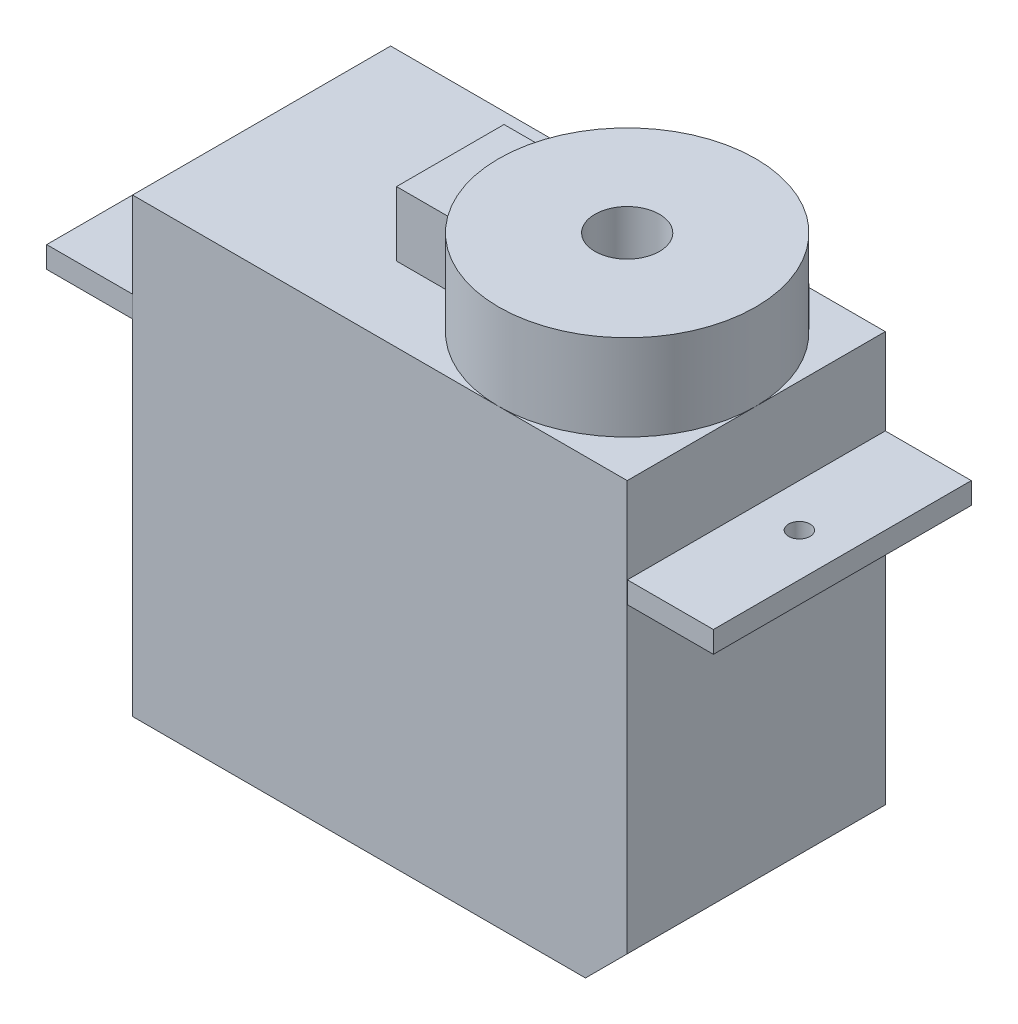
ISO-10303-21;
HEADER;
FILE_DESCRIPTION(('STEP AP214'),'2;1');
FILE_NAME('part.step','',(''),(''),'','','');
FILE_SCHEMA(('AUTOMOTIVE_DESIGN { 1 0 10303 214 1 1 1 1 }'));
ENDSEC;
DATA;
#1=APPLICATION_CONTEXT('core data for automotive mechanical design processes');
#2=APPLICATION_PROTOCOL_DEFINITION('international standard','automotive_design',2000,#1);
#3=PRODUCT_CONTEXT('',#1,'mechanical');
#4=PRODUCT('Part','Part','',(#3));
#5=PRODUCT_RELATED_PRODUCT_CATEGORY('part','',(#4));
#6=PRODUCT_DEFINITION_FORMATION('','',#4);
#7=PRODUCT_DEFINITION_CONTEXT('part definition',#1,'design');
#8=PRODUCT_DEFINITION('design','',#6,#7);
#9=PRODUCT_DEFINITION_SHAPE('','',#8);
#10=(LENGTH_UNIT() NAMED_UNIT(*) SI_UNIT(.MILLI.,.METRE.));
#11=(NAMED_UNIT(*) PLANE_ANGLE_UNIT() SI_UNIT($,.RADIAN.));
#12=(NAMED_UNIT(*) SI_UNIT($,.STERADIAN.) SOLID_ANGLE_UNIT());
#13=UNCERTAINTY_MEASURE_WITH_UNIT(LENGTH_MEASURE(1.E-05),#10,'distance_accuracy_value','');
#14=(GEOMETRIC_REPRESENTATION_CONTEXT(3) GLOBAL_UNCERTAINTY_ASSIGNED_CONTEXT((#13)) GLOBAL_UNIT_ASSIGNED_CONTEXT((#10,
#11,#12)) REPRESENTATION_CONTEXT('',''));
#15=CARTESIAN_POINT('',(0.,0.,0.));
#16=DIRECTION('',(0.,0.,1.));
#17=DIRECTION('',(1.,0.,0.));
#18=AXIS2_PLACEMENT_3D('',#15,#16,#17);
#19=CARTESIAN_POINT('',(0.,21.,0.));
#20=DIRECTION('',(0.,1.,0.));
#21=DIRECTION('',(0.,0.,1.));
#22=AXIS2_PLACEMENT_3D('',#19,#20,#21);
#23=PLANE('',#22);
#24=CARTESIAN_POINT('',(5.52357019337868,21.,0.0235701933786747));
#25=DIRECTION('',(0.,1.,0.));
#26=DIRECTION('',(0.,0.,1.));
#27=AXIS2_PLACEMENT_3D('',#24,#25,#26);
#28=CIRCLE('',#27,5.97642980662132);
#29=CARTESIAN_POINT('',(0.0951529992537095,21.,2.52357019337872));
#30=VERTEX_POINT('',#29);
#31=CARTESIAN_POINT('',(5.52357019337868,21.,6.));
#32=VERTEX_POINT('',#31);
#33=EDGE_CURVE('E196',#30,#32,#28,.T.);
#34=ORIENTED_EDGE('',*,*,#33,.F.);
#35=DIRECTION('',(1.,0.,0.));
#36=VECTOR('',#35,1.);
#37=CARTESIAN_POINT('',(1.79714038675735,21.,2.52357019337872));
#38=LINE('',#37,#36);
#39=CARTESIAN_POINT('',(-2.70285961324265,21.,2.52357019337872));
#40=VERTEX_POINT('',#39);
#41=EDGE_CURVE('E64',#40,#30,#38,.T.);
#42=ORIENTED_EDGE('',*,*,#41,.F.);
#43=DIRECTION('',(0.,0.,1.));
#44=VECTOR('',#43,1.);
#45=CARTESIAN_POINT('',(-2.70285961324265,21.,-2.47642980662128));
#46=LINE('',#45,#44);
#47=CARTESIAN_POINT('',(-2.70285961324265,21.,-2.47642980662128));
#48=VERTEX_POINT('',#47);
#49=EDGE_CURVE('E237',#48,#40,#46,.T.);
#50=ORIENTED_EDGE('',*,*,#49,.F.);
#51=DIRECTION('',(-1.,0.,0.));
#52=VECTOR('',#51,1.);
#53=CARTESIAN_POINT('',(1.79714038675735,21.,-2.47642980662128));
#54=LINE('',#53,#52);
#55=CARTESIAN_POINT('',(0.0951529992536714,21.,-2.47642980662128));
#56=VERTEX_POINT('',#55);
#57=EDGE_CURVE('E213',#56,#48,#54,.T.);
#58=ORIENTED_EDGE('',*,*,#57,.F.);
#59=CARTESIAN_POINT('',(11.5,21.,0.0235701933786747));
#60=VERTEX_POINT('',#59);
#61=EDGE_CURVE('E205',#60,#56,#28,.T.);
#62=ORIENTED_EDGE('',*,*,#61,.F.);
#63=DIRECTION('',(0.,0.,-1.));
#64=VECTOR('',#63,1.);
#65=CARTESIAN_POINT('',(11.5,21.,-6.));
#66=LINE('',#65,#64);
#67=CARTESIAN_POINT('',(11.5,21.,-6.));
#68=VERTEX_POINT('',#67);
#69=EDGE_CURVE('E356',#60,#68,#66,.T.);
#70=ORIENTED_EDGE('',*,*,#69,.T.);
#71=DIRECTION('',(-1.,0.,0.));
#72=VECTOR('',#71,1.);
#73=CARTESIAN_POINT('',(-11.5,21.,-6.));
#74=LINE('',#73,#72);
#75=CARTESIAN_POINT('',(-11.5,21.,-6.));
#76=VERTEX_POINT('',#75);
#77=EDGE_CURVE('E355',#68,#76,#74,.T.);
#78=ORIENTED_EDGE('',*,*,#77,.T.);
#79=DIRECTION('',(0.,0.,1.));
#80=VECTOR('',#79,1.);
#81=CARTESIAN_POINT('',(-11.5,21.,-6.));
#82=LINE('',#81,#80);
#83=CARTESIAN_POINT('',(-11.5,21.,6.));
#84=VERTEX_POINT('',#83);
#85=EDGE_CURVE('E359',#76,#84,#82,.T.);
#86=ORIENTED_EDGE('',*,*,#85,.T.);
#87=DIRECTION('',(1.,0.,0.));
#88=VECTOR('',#87,1.);
#89=CARTESIAN_POINT('',(-11.5,21.,6.));
#90=LINE('',#89,#88);
#91=EDGE_CURVE('E363',#84,#32,#90,.T.);
#92=ORIENTED_EDGE('',*,*,#91,.T.);
#93=EDGE_LOOP('',(#34,#42,#50,#58,#62,#70,#78,#86,#92));
#94=FACE_BOUND('',#93,.T.);
#95=ADVANCED_FACE('F40',(#94),#23,.T.);
#96=CARTESIAN_POINT('',(5.52357019337868,25.,0.0235701933786747));
#97=DIRECTION('',(0.,-1.,0.));
#98=DIRECTION('',(0.,0.,-1.));
#99=AXIS2_PLACEMENT_3D('',#96,#97,#98);
#100=CYLINDRICAL_SURFACE('',#99,5.97642980662132);
#101=CARTESIAN_POINT('',(5.52357019337868,25.,0.0235701933786747));
#102=DIRECTION('',(0.,1.,0.));
#103=DIRECTION('',(0.,0.,1.));
#104=AXIS2_PLACEMENT_3D('',#101,#102,#103);
#105=CIRCLE('',#104,5.97642980662132);
#106=CARTESIAN_POINT('',(5.52357019337868,25.,6.));
#107=VERTEX_POINT('',#106);
#108=EDGE_CURVE('E251',#107,#107,#105,.T.);
#109=ORIENTED_EDGE('',*,*,#108,.F.);
#110=EDGE_LOOP('',(#109));
#111=FACE_BOUND('',#110,.T.);
#112=DIRECTION('',(0.,-1.,0.));
#113=VECTOR('',#112,1.);
#114=CARTESIAN_POINT('',(0.0951529992537095,25.,2.52357019337872));
#115=LINE('',#114,#113);
#116=CARTESIAN_POINT('',(0.0951529992537095,24.,2.52357019337872));
#117=VERTEX_POINT('',#116);
#118=EDGE_CURVE('E11',#30,#117,#115,.F.);
#119=ORIENTED_EDGE('',*,*,#118,.F.);
#120=ORIENTED_EDGE('',*,*,#33,.T.);
#121=EDGE_CURVE('E250',#32,#60,#28,.T.);
#122=ORIENTED_EDGE('',*,*,#121,.T.);
#123=ORIENTED_EDGE('',*,*,#61,.T.);
#124=DIRECTION('',(0.,-1.,0.));
#125=VECTOR('',#124,1.);
#126=CARTESIAN_POINT('',(0.0951529992536714,25.,-2.47642980662128));
#127=LINE('',#126,#125);
#128=CARTESIAN_POINT('',(0.0951529992536714,24.,-2.47642980662128));
#129=VERTEX_POINT('',#128);
#130=EDGE_CURVE('E49',#129,#56,#127,.T.);
#131=ORIENTED_EDGE('',*,*,#130,.F.);
#132=CARTESIAN_POINT('',(5.52357019337868,24.,0.0235701933786747));
#133=DIRECTION('',(0.,-1.,0.));
#134=DIRECTION('',(0.,0.,-1.));
#135=AXIS2_PLACEMENT_3D('',#132,#133,#134);
#136=CIRCLE('',#135,5.97642980662132);
#137=EDGE_CURVE('E202',#117,#129,#136,.T.);
#138=ORIENTED_EDGE('',*,*,#137,.F.);
#139=EDGE_LOOP('',(#119,#120,#122,#123,#131,#138));
#140=FACE_BOUND('',#139,.T.);
#141=ADVANCED_FACE('F218',(#111,#140),#100,.T.);
#142=ORIENTED_EDGE('',*,*,#121,.F.);
#143=CARTESIAN_POINT('',(11.5,21.,6.));
#144=VERTEX_POINT('',#143);
#145=EDGE_CURVE('E362',#32,#144,#90,.T.);
#146=ORIENTED_EDGE('',*,*,#145,.T.);
#147=EDGE_CURVE('E351',#144,#60,#66,.T.);
#148=ORIENTED_EDGE('',*,*,#147,.T.);
#149=EDGE_LOOP('',(#142,#146,#148));
#150=FACE_BOUND('',#149,.T.);
#151=ADVANCED_FACE('F421',(#150),#23,.T.);
#152=CARTESIAN_POINT('',(-11.5,21.,-6.));
#153=DIRECTION('',(1.,0.,0.));
#154=DIRECTION('',(0.,0.,-1.));
#155=AXIS2_PLACEMENT_3D('',#152,#153,#154);
#156=PLANE('',#155);
#157=DIRECTION('',(0.,0.,1.));
#158=VECTOR('',#157,1.);
#159=CARTESIAN_POINT('',(-11.5,16.,-6.));
#160=LINE('',#159,#158);
#161=CARTESIAN_POINT('',(-11.5,16.,-6.));
#162=VERTEX_POINT('',#161);
#163=CARTESIAN_POINT('',(-11.5,16.,5.99258531427078));
#164=VERTEX_POINT('',#163);
#165=EDGE_CURVE('E262',#162,#164,#160,.T.);
#166=ORIENTED_EDGE('',*,*,#165,.F.);
#167=DIRECTION('',(0.,-1.,0.));
#168=VECTOR('',#167,1.);
#169=CARTESIAN_POINT('',(-11.5,21.,-6.));
#170=LINE('',#169,#168);
#171=CARTESIAN_POINT('',(-11.5,0.,-6.));
#172=VERTEX_POINT('',#171);
#173=EDGE_CURVE('E198',#162,#172,#170,.T.);
#174=ORIENTED_EDGE('',*,*,#173,.T.);
#175=DIRECTION('',(0.,0.,1.));
#176=VECTOR('',#175,1.);
#177=CARTESIAN_POINT('',(-11.5,0.,-6.));
#178=LINE('',#177,#176);
#179=CARTESIAN_POINT('',(-11.5,0.,6.));
#180=VERTEX_POINT('',#179);
#181=EDGE_CURVE('E369',#172,#180,#178,.T.);
#182=ORIENTED_EDGE('',*,*,#181,.T.);
#183=DIRECTION('',(0.,-1.,0.));
#184=VECTOR('',#183,1.);
#185=CARTESIAN_POINT('',(-11.5,21.,6.));
#186=LINE('',#185,#184);
#187=EDGE_CURVE('E377',#84,#180,#186,.T.);
#188=ORIENTED_EDGE('',*,*,#187,.F.);
#189=ORIENTED_EDGE('',*,*,#85,.F.);
#190=CARTESIAN_POINT('',(-11.5,17.,-6.));
#191=VERTEX_POINT('',#190);
#192=EDGE_CURVE('E191',#76,#191,#170,.T.);
#193=ORIENTED_EDGE('',*,*,#192,.T.);
#194=DIRECTION('',(0.,0.,1.));
#195=VECTOR('',#194,1.);
#196=CARTESIAN_POINT('',(-11.5,17.,-6.));
#197=LINE('',#196,#195);
#198=CARTESIAN_POINT('',(-11.5,17.,5.99258531427078));
#199=VERTEX_POINT('',#198);
#200=EDGE_CURVE('E266',#191,#199,#197,.T.);
#201=ORIENTED_EDGE('',*,*,#200,.T.);
#202=DIRECTION('',(0.,-1.,0.));
#203=VECTOR('',#202,1.);
#204=CARTESIAN_POINT('',(-11.5,17.,5.99258531427078));
#205=LINE('',#204,#203);
#206=EDGE_CURVE('E283',#199,#164,#205,.T.);
#207=ORIENTED_EDGE('',*,*,#206,.T.);
#208=EDGE_LOOP('',(#166,#174,#182,#188,#189,#193,#201,#207));
#209=FACE_BOUND('',#208,.T.);
#210=ADVANCED_FACE('F390',(#209),#156,.F.);
#211=CARTESIAN_POINT('',(11.5,21.,-6.));
#212=DIRECTION('',(-1.,0.,0.));
#213=DIRECTION('',(0.,0.,1.));
#214=AXIS2_PLACEMENT_3D('',#211,#212,#213);
#215=PLANE('',#214);
#216=DIRECTION('',(0.,-1.,0.));
#217=VECTOR('',#216,1.);
#218=CARTESIAN_POINT('',(11.5,21.,6.));
#219=LINE('',#218,#217);
#220=CARTESIAN_POINT('',(11.5,1.94058057976703,6.));
#221=VERTEX_POINT('',#220);
#222=EDGE_CURVE('E181',#144,#221,#219,.T.);
#223=ORIENTED_EDGE('',*,*,#222,.T.);
#224=DIRECTION('',(0.,0.,1.));
#225=VECTOR('',#224,1.);
#226=CARTESIAN_POINT('',(11.5,1.94058057976703,-6.));
#227=LINE('',#226,#225);
#228=CARTESIAN_POINT('',(11.5,1.94058057976703,-6.));
#229=VERTEX_POINT('',#228);
#230=EDGE_CURVE('E168',#229,#221,#227,.T.);
#231=ORIENTED_EDGE('',*,*,#230,.F.);
#232=DIRECTION('',(0.,-1.,0.));
#233=VECTOR('',#232,1.);
#234=CARTESIAN_POINT('',(11.5,21.,-6.));
#235=LINE('',#234,#233);
#236=CARTESIAN_POINT('',(11.5,16.,-6.));
#237=VERTEX_POINT('',#236);
#238=EDGE_CURVE('E177',#237,#229,#235,.T.);
#239=ORIENTED_EDGE('',*,*,#238,.F.);
#240=DIRECTION('',(0.,0.,1.));
#241=VECTOR('',#240,1.);
#242=CARTESIAN_POINT('',(11.5,16.,-6.));
#243=LINE('',#242,#241);
#244=CARTESIAN_POINT('',(11.5,16.,5.99258531427078));
#245=VERTEX_POINT('',#244);
#246=EDGE_CURVE('E311',#237,#245,#243,.T.);
#247=ORIENTED_EDGE('',*,*,#246,.T.);
#248=DIRECTION('',(0.,-1.,0.));
#249=VECTOR('',#248,1.);
#250=CARTESIAN_POINT('',(11.5,17.,5.99258531427078));
#251=LINE('',#250,#249);
#252=CARTESIAN_POINT('',(11.5,17.,5.99258531427078));
#253=VERTEX_POINT('',#252);
#254=EDGE_CURVE('E346',#253,#245,#251,.T.);
#255=ORIENTED_EDGE('',*,*,#254,.F.);
#256=DIRECTION('',(0.,0.,1.));
#257=VECTOR('',#256,1.);
#258=CARTESIAN_POINT('',(11.5,17.,-6.));
#259=LINE('',#258,#257);
#260=CARTESIAN_POINT('',(11.5,17.,-6.));
#261=VERTEX_POINT('',#260);
#262=EDGE_CURVE('E315',#261,#253,#259,.T.);
#263=ORIENTED_EDGE('',*,*,#262,.F.);
#264=EDGE_CURVE('E190',#68,#261,#235,.T.);
#265=ORIENTED_EDGE('',*,*,#264,.F.);
#266=ORIENTED_EDGE('',*,*,#69,.F.);
#267=ORIENTED_EDGE('',*,*,#147,.F.);
#268=EDGE_LOOP('',(#223,#231,#239,#247,#255,#263,#265,#266,#267));
#269=FACE_BOUND('',#268,.T.);
#270=ADVANCED_FACE('F42',(#269),#215,.F.);
#271=CARTESIAN_POINT('',(-11.5,21.,-6.));
#272=DIRECTION('',(0.,0.,1.));
#273=DIRECTION('',(1.,0.,0.));
#274=AXIS2_PLACEMENT_3D('',#271,#272,#273);
#275=PLANE('',#274);
#276=ORIENTED_EDGE('',*,*,#238,.T.);
#277=DIRECTION('',(-0.707106781186545,-0.70710678118655,0.));
#278=VECTOR('',#277,1.);
#279=CARTESIAN_POINT('',(9.55941942023299,0.,-6.));
#280=LINE('',#279,#278);
#281=CARTESIAN_POINT('',(9.55941942023299,0.,-6.));
#282=VERTEX_POINT('',#281);
#283=EDGE_CURVE('E165',#229,#282,#280,.T.);
#284=ORIENTED_EDGE('',*,*,#283,.T.);
#285=DIRECTION('',(-1.,0.,0.));
#286=VECTOR('',#285,1.);
#287=CARTESIAN_POINT('',(-11.5,0.,-6.));
#288=LINE('',#287,#286);
#289=EDGE_CURVE('E350',#282,#172,#288,.T.);
#290=ORIENTED_EDGE('',*,*,#289,.T.);
#291=ORIENTED_EDGE('',*,*,#173,.F.);
#292=DIRECTION('',(1.,0.,0.));
#293=VECTOR('',#292,1.);
#294=CARTESIAN_POINT('',(-11.5,16.,-6.));
#295=LINE('',#294,#293);
#296=CARTESIAN_POINT('',(-15.5,16.,-6.));
#297=VERTEX_POINT('',#296);
#298=EDGE_CURVE('E287',#297,#162,#295,.T.);
#299=ORIENTED_EDGE('',*,*,#298,.F.);
#300=DIRECTION('',(0.,-1.,0.));
#301=VECTOR('',#300,1.);
#302=CARTESIAN_POINT('',(-15.5,17.,-6.));
#303=LINE('',#302,#301);
#304=CARTESIAN_POINT('',(-15.5,17.,-6.));
#305=VERTEX_POINT('',#304);
#306=EDGE_CURVE('E303',#305,#297,#303,.T.);
#307=ORIENTED_EDGE('',*,*,#306,.F.);
#308=DIRECTION('',(1.,0.,0.));
#309=VECTOR('',#308,1.);
#310=CARTESIAN_POINT('',(-11.5,17.,-6.));
#311=LINE('',#310,#309);
#312=EDGE_CURVE('E270',#305,#191,#311,.T.);
#313=ORIENTED_EDGE('',*,*,#312,.T.);
#314=ORIENTED_EDGE('',*,*,#192,.F.);
#315=ORIENTED_EDGE('',*,*,#77,.F.);
#316=ORIENTED_EDGE('',*,*,#264,.T.);
#317=DIRECTION('',(-1.,0.,0.));
#318=VECTOR('',#317,1.);
#319=CARTESIAN_POINT('',(11.5,17.,-6.));
#320=LINE('',#319,#318);
#321=CARTESIAN_POINT('',(15.5,17.,-6.));
#322=VERTEX_POINT('',#321);
#323=EDGE_CURVE('E325',#322,#261,#320,.T.);
#324=ORIENTED_EDGE('',*,*,#323,.F.);
#325=DIRECTION('',(0.,-1.,0.));
#326=VECTOR('',#325,1.);
#327=CARTESIAN_POINT('',(15.5,17.,-6.));
#328=LINE('',#327,#326);
#329=CARTESIAN_POINT('',(15.5,16.,-6.));
#330=VERTEX_POINT('',#329);
#331=EDGE_CURVE('E329',#322,#330,#328,.T.);
#332=ORIENTED_EDGE('',*,*,#331,.T.);
#333=DIRECTION('',(-1.,0.,0.));
#334=VECTOR('',#333,1.);
#335=CARTESIAN_POINT('',(11.5,16.,-6.));
#336=LINE('',#335,#334);
#337=EDGE_CURVE('E187',#330,#237,#336,.T.);
#338=ORIENTED_EDGE('',*,*,#337,.T.);
#339=EDGE_LOOP('',(#276,#284,#290,#291,#299,#307,#313,#314,#315,#316,#324,#332,#338));
#340=FACE_BOUND('',#339,.T.);
#341=ADVANCED_FACE('F184',(#340),#275,.F.);
#342=CARTESIAN_POINT('',(-11.5,21.,6.));
#343=DIRECTION('',(0.,0.,-1.));
#344=DIRECTION('',(-1.,0.,0.));
#345=AXIS2_PLACEMENT_3D('',#342,#343,#344);
#346=PLANE('',#345);
#347=DIRECTION('',(1.,0.,0.));
#348=VECTOR('',#347,1.);
#349=CARTESIAN_POINT('',(-11.5,0.,6.));
#350=LINE('',#349,#348);
#351=CARTESIAN_POINT('',(9.55941942023299,0.,6.));
#352=VERTEX_POINT('',#351);
#353=EDGE_CURVE('E372',#180,#352,#350,.T.);
#354=ORIENTED_EDGE('',*,*,#353,.T.);
#355=DIRECTION('',(-0.707106781186545,-0.70710678118655,0.));
#356=VECTOR('',#355,1.);
#357=CARTESIAN_POINT('',(9.55941942023299,0.,6.));
#358=LINE('',#357,#356);
#359=EDGE_CURVE('E56',#221,#352,#358,.T.);
#360=ORIENTED_EDGE('',*,*,#359,.F.);
#361=ORIENTED_EDGE('',*,*,#222,.F.);
#362=ORIENTED_EDGE('',*,*,#145,.F.);
#363=ORIENTED_EDGE('',*,*,#91,.F.);
#364=ORIENTED_EDGE('',*,*,#187,.T.);
#365=EDGE_LOOP('',(#354,#360,#361,#362,#363,#364));
#366=FACE_BOUND('',#365,.T.);
#367=ADVANCED_FACE('F394',(#366),#346,.F.);
#368=CARTESIAN_POINT('',(0.,0.,0.));
#369=DIRECTION('',(0.,1.,0.));
#370=DIRECTION('',(0.,0.,1.));
#371=AXIS2_PLACEMENT_3D('',#368,#369,#370);
#372=PLANE('',#371);
#373=ORIENTED_EDGE('',*,*,#289,.F.);
#374=DIRECTION('',(0.,0.,1.));
#375=VECTOR('',#374,1.);
#376=CARTESIAN_POINT('',(9.55941942023299,0.,-6.));
#377=LINE('',#376,#375);
#378=EDGE_CURVE('E169',#282,#352,#377,.T.);
#379=ORIENTED_EDGE('',*,*,#378,.T.);
#380=ORIENTED_EDGE('',*,*,#353,.F.);
#381=ORIENTED_EDGE('',*,*,#181,.F.);
#382=EDGE_LOOP('',(#373,#379,#380,#381));
#383=FACE_BOUND('',#382,.T.);
#384=ADVANCED_FACE('F393',(#383),#372,.F.);
#385=CARTESIAN_POINT('',(11.5,17.,5.99258531427078));
#386=DIRECTION('',(0.,0.,-1.));
#387=DIRECTION('',(-1.,0.,0.));
#388=AXIS2_PLACEMENT_3D('',#385,#386,#387);
#389=PLANE('',#388);
#390=DIRECTION('',(1.,0.,0.));
#391=VECTOR('',#390,1.);
#392=CARTESIAN_POINT('',(11.5,16.,5.99258531427078));
#393=LINE('',#392,#391);
#394=CARTESIAN_POINT('',(15.5,16.,5.99258531427078));
#395=VERTEX_POINT('',#394);
#396=EDGE_CURVE('E332',#245,#395,#393,.T.);
#397=ORIENTED_EDGE('',*,*,#396,.T.);
#398=DIRECTION('',(0.,-1.,0.));
#399=VECTOR('',#398,1.);
#400=CARTESIAN_POINT('',(15.5,17.,5.99258531427078));
#401=LINE('',#400,#399);
#402=CARTESIAN_POINT('',(15.5,17.,5.99258531427078));
#403=VERTEX_POINT('',#402);
#404=EDGE_CURVE('E342',#403,#395,#401,.T.);
#405=ORIENTED_EDGE('',*,*,#404,.F.);
#406=DIRECTION('',(1.,0.,0.));
#407=VECTOR('',#406,1.);
#408=CARTESIAN_POINT('',(11.5,17.,5.99258531427078));
#409=LINE('',#408,#407);
#410=EDGE_CURVE('E319',#253,#403,#409,.T.);
#411=ORIENTED_EDGE('',*,*,#410,.F.);
#412=ORIENTED_EDGE('',*,*,#254,.T.);
#413=EDGE_LOOP('',(#397,#405,#411,#412));
#414=FACE_BOUND('',#413,.T.);
#415=ADVANCED_FACE('F465',(#414),#389,.F.);
#416=CARTESIAN_POINT('',(15.5,17.,-6.));
#417=DIRECTION('',(-1.,0.,0.));
#418=DIRECTION('',(0.,0.,1.));
#419=AXIS2_PLACEMENT_3D('',#416,#417,#418);
#420=PLANE('',#419);
#421=DIRECTION('',(0.,0.,-1.));
#422=VECTOR('',#421,1.);
#423=CARTESIAN_POINT('',(15.5,16.,-6.));
#424=LINE('',#423,#422);
#425=EDGE_CURVE('E335',#395,#330,#424,.T.);
#426=ORIENTED_EDGE('',*,*,#425,.T.);
#427=ORIENTED_EDGE('',*,*,#331,.F.);
#428=DIRECTION('',(0.,0.,-1.));
#429=VECTOR('',#428,1.);
#430=CARTESIAN_POINT('',(15.5,17.,-6.));
#431=LINE('',#430,#429);
#432=EDGE_CURVE('E322',#403,#322,#431,.T.);
#433=ORIENTED_EDGE('',*,*,#432,.F.);
#434=ORIENTED_EDGE('',*,*,#404,.T.);
#435=EDGE_LOOP('',(#426,#427,#433,#434));
#436=FACE_BOUND('',#435,.T.);
#437=ADVANCED_FACE('F458',(#436),#420,.F.);
#438=CARTESIAN_POINT('',(0.,17.,0.));
#439=DIRECTION('',(0.,1.,0.));
#440=DIRECTION('',(0.,0.,1.));
#441=AXIS2_PLACEMENT_3D('',#438,#439,#440);
#442=PLANE('',#441);
#443=CARTESIAN_POINT('',(13.5,17.,-0.00370734286461033));
#444=DIRECTION('',(0.,1.,0.));
#445=DIRECTION('',(0.,0.,1.));
#446=AXIS2_PLACEMENT_3D('',#443,#444,#445);
#447=CIRCLE('',#446,0.500000000000001);
#448=CARTESIAN_POINT('',(13.5,17.,0.49629265713539));
#449=VERTEX_POINT('',#448);
#450=EDGE_CURVE('E306',#449,#449,#447,.T.);
#451=ORIENTED_EDGE('',*,*,#450,.F.);
#452=EDGE_LOOP('',(#451));
#453=FACE_BOUND('',#452,.T.);
#454=ORIENTED_EDGE('',*,*,#262,.T.);
#455=ORIENTED_EDGE('',*,*,#410,.T.);
#456=ORIENTED_EDGE('',*,*,#432,.T.);
#457=ORIENTED_EDGE('',*,*,#323,.T.);
#458=EDGE_LOOP('',(#454,#455,#456,#457));
#459=FACE_BOUND('',#458,.T.);
#460=ADVANCED_FACE('F455',(#453,#459),#442,.T.);
#461=CARTESIAN_POINT('',(0.,16.,0.));
#462=DIRECTION('',(0.,1.,0.));
#463=DIRECTION('',(0.,0.,1.));
#464=AXIS2_PLACEMENT_3D('',#461,#462,#463);
#465=PLANE('',#464);
#466=CARTESIAN_POINT('',(13.5,16.,-0.00370734286461033));
#467=DIRECTION('',(0.,1.,0.));
#468=DIRECTION('',(0.,0.,1.));
#469=AXIS2_PLACEMENT_3D('',#466,#467,#468);
#470=CIRCLE('',#469,0.500000000000001);
#471=CARTESIAN_POINT('',(13.5,16.,0.49629265713539));
#472=VERTEX_POINT('',#471);
#473=EDGE_CURVE('E307',#472,#472,#470,.T.);
#474=ORIENTED_EDGE('',*,*,#473,.T.);
#475=EDGE_LOOP('',(#474));
#476=FACE_BOUND('',#475,.T.);
#477=ORIENTED_EDGE('',*,*,#246,.F.);
#478=ORIENTED_EDGE('',*,*,#337,.F.);
#479=ORIENTED_EDGE('',*,*,#425,.F.);
#480=ORIENTED_EDGE('',*,*,#396,.F.);
#481=EDGE_LOOP('',(#477,#478,#479,#480));
#482=FACE_BOUND('',#481,.T.);
#483=ADVANCED_FACE('F453',(#476,#482),#465,.F.);
#484=CARTESIAN_POINT('',(13.5,16.,-0.00370734286461033));
#485=DIRECTION('',(0.,1.,0.));
#486=DIRECTION('',(0.,0.,1.));
#487=AXIS2_PLACEMENT_3D('',#484,#485,#486);
#488=CYLINDRICAL_SURFACE('',#487,0.500000000000001);
#489=ORIENTED_EDGE('',*,*,#473,.F.);
#490=EDGE_LOOP('',(#489));
#491=FACE_BOUND('',#490,.T.);
#492=ORIENTED_EDGE('',*,*,#450,.T.);
#493=EDGE_LOOP('',(#492));
#494=FACE_BOUND('',#493,.T.);
#495=ADVANCED_FACE('F449',(#491,#494),#488,.F.);
#496=CARTESIAN_POINT('',(-15.5,17.,-6.));
#497=DIRECTION('',(-1.,0.,0.));
#498=DIRECTION('',(0.,0.,1.));
#499=AXIS2_PLACEMENT_3D('',#496,#497,#498);
#500=PLANE('',#499);
#501=DIRECTION('',(0.,0.,-1.));
#502=VECTOR('',#501,1.);
#503=CARTESIAN_POINT('',(-15.5,16.,-6.));
#504=LINE('',#503,#502);
#505=CARTESIAN_POINT('',(-15.5,16.,5.99258531427078));
#506=VERTEX_POINT('',#505);
#507=EDGE_CURVE('E290',#506,#297,#504,.T.);
#508=ORIENTED_EDGE('',*,*,#507,.F.);
#509=DIRECTION('',(0.,-1.,0.));
#510=VECTOR('',#509,1.);
#511=CARTESIAN_POINT('',(-15.5,17.,5.99258531427078));
#512=LINE('',#511,#510);
#513=CARTESIAN_POINT('',(-15.5,17.,5.99258531427078));
#514=VERTEX_POINT('',#513);
#515=EDGE_CURVE('E300',#514,#506,#512,.T.);
#516=ORIENTED_EDGE('',*,*,#515,.F.);
#517=DIRECTION('',(0.,0.,-1.));
#518=VECTOR('',#517,1.);
#519=CARTESIAN_POINT('',(-15.5,17.,-6.));
#520=LINE('',#519,#518);
#521=EDGE_CURVE('E275',#514,#305,#520,.T.);
#522=ORIENTED_EDGE('',*,*,#521,.T.);
#523=ORIENTED_EDGE('',*,*,#306,.T.);
#524=EDGE_LOOP('',(#508,#516,#522,#523));
#525=FACE_BOUND('',#524,.T.);
#526=ADVANCED_FACE('F445',(#525),#500,.T.);
#527=CARTESIAN_POINT('',(-11.5,17.,5.99258531427078));
#528=DIRECTION('',(0.,0.,1.));
#529=DIRECTION('',(1.,0.,0.));
#530=AXIS2_PLACEMENT_3D('',#527,#528,#529);
#531=PLANE('',#530);
#532=DIRECTION('',(-1.,0.,0.));
#533=VECTOR('',#532,1.);
#534=CARTESIAN_POINT('',(-11.5,16.,5.99258531427078));
#535=LINE('',#534,#533);
#536=EDGE_CURVE('E271',#164,#506,#535,.T.);
#537=ORIENTED_EDGE('',*,*,#536,.F.);
#538=ORIENTED_EDGE('',*,*,#206,.F.);
#539=DIRECTION('',(-1.,0.,0.));
#540=VECTOR('',#539,1.);
#541=CARTESIAN_POINT('',(-11.5,17.,5.99258531427078));
#542=LINE('',#541,#540);
#543=EDGE_CURVE('E279',#199,#514,#542,.T.);
#544=ORIENTED_EDGE('',*,*,#543,.T.);
#545=ORIENTED_EDGE('',*,*,#515,.T.);
#546=EDGE_LOOP('',(#537,#538,#544,#545));
#547=FACE_BOUND('',#546,.T.);
#548=ADVANCED_FACE('F438',(#547),#531,.T.);
#549=CARTESIAN_POINT('',(0.,17.,0.));
#550=DIRECTION('',(0.,1.,0.));
#551=DIRECTION('',(0.,0.,1.));
#552=AXIS2_PLACEMENT_3D('',#549,#550,#551);
#553=PLANE('',#552);
#554=CARTESIAN_POINT('',(-13.5,17.,-0.00370734286461033));
#555=DIRECTION('',(0.,-1.,0.));
#556=DIRECTION('',(0.,0.,1.));
#557=AXIS2_PLACEMENT_3D('',#554,#555,#556);
#558=CIRCLE('',#557,0.500000000000001);
#559=CARTESIAN_POINT('',(-13.5,17.,0.49629265713539));
#560=VERTEX_POINT('',#559);
#561=EDGE_CURVE('E255',#560,#560,#558,.T.);
#562=ORIENTED_EDGE('',*,*,#561,.T.);
#563=EDGE_LOOP('',(#562));
#564=FACE_BOUND('',#563,.T.);
#565=ORIENTED_EDGE('',*,*,#200,.F.);
#566=ORIENTED_EDGE('',*,*,#312,.F.);
#567=ORIENTED_EDGE('',*,*,#521,.F.);
#568=ORIENTED_EDGE('',*,*,#543,.F.);
#569=EDGE_LOOP('',(#565,#566,#567,#568));
#570=FACE_BOUND('',#569,.T.);
#571=ADVANCED_FACE('F435',(#564,#570),#553,.T.);
#572=CARTESIAN_POINT('',(0.,16.,0.));
#573=DIRECTION('',(0.,1.,0.));
#574=DIRECTION('',(0.,0.,1.));
#575=AXIS2_PLACEMENT_3D('',#572,#573,#574);
#576=PLANE('',#575);
#577=CARTESIAN_POINT('',(-13.5,16.,-0.00370734286461033));
#578=DIRECTION('',(0.,-1.,0.));
#579=DIRECTION('',(0.,0.,1.));
#580=AXIS2_PLACEMENT_3D('',#577,#578,#579);
#581=CIRCLE('',#580,0.500000000000001);
#582=CARTESIAN_POINT('',(-13.5,16.,0.49629265713539));
#583=VERTEX_POINT('',#582);
#584=EDGE_CURVE('E258',#583,#583,#581,.T.);
#585=ORIENTED_EDGE('',*,*,#584,.F.);
#586=EDGE_LOOP('',(#585));
#587=FACE_BOUND('',#586,.T.);
#588=ORIENTED_EDGE('',*,*,#165,.T.);
#589=ORIENTED_EDGE('',*,*,#536,.T.);
#590=ORIENTED_EDGE('',*,*,#507,.T.);
#591=ORIENTED_EDGE('',*,*,#298,.T.);
#592=EDGE_LOOP('',(#588,#589,#590,#591));
#593=FACE_BOUND('',#592,.T.);
#594=ADVANCED_FACE('F433',(#587,#593),#576,.F.);
#595=CARTESIAN_POINT('',(-13.5,16.,-0.00370734286461033));
#596=DIRECTION('',(0.,1.,0.));
#597=DIRECTION('',(0.,0.,1.));
#598=AXIS2_PLACEMENT_3D('',#595,#596,#597);
#599=CYLINDRICAL_SURFACE('',#598,0.500000000000001);
#600=ORIENTED_EDGE('',*,*,#584,.T.);
#601=EDGE_LOOP('',(#600));
#602=FACE_BOUND('',#601,.T.);
#603=ORIENTED_EDGE('',*,*,#561,.F.);
#604=EDGE_LOOP('',(#603));
#605=FACE_BOUND('',#604,.T.);
#606=ADVANCED_FACE('F416',(#602,#605),#599,.F.);
#607=CARTESIAN_POINT('',(5.52357019337868,25.,0.0235701933786747));
#608=DIRECTION('',(0.,1.,0.));
#609=DIRECTION('',(0.,0.,1.));
#610=AXIS2_PLACEMENT_3D('',#607,#608,#609);
#611=PLANE('',#610);
#612=CARTESIAN_POINT('',(5.52357019337868,25.,0.0235701933786747));
#613=DIRECTION('',(0.,1.,0.));
#614=DIRECTION('',(0.,0.,1.));
#615=AXIS2_PLACEMENT_3D('',#612,#613,#614);
#616=CIRCLE('',#615,1.5);
#617=CARTESIAN_POINT('',(5.52357019337868,25.,1.52357019337867));
#618=VERTEX_POINT('',#617);
#619=EDGE_CURVE('E401',#618,#618,#616,.T.);
#620=ORIENTED_EDGE('',*,*,#619,.F.);
#621=EDGE_LOOP('',(#620));
#622=FACE_BOUND('',#621,.T.);
#623=ORIENTED_EDGE('',*,*,#108,.T.);
#624=EDGE_LOOP('',(#623));
#625=FACE_BOUND('',#624,.T.);
#626=ADVANCED_FACE('F412',(#622,#625),#611,.T.);
#627=CARTESIAN_POINT('',(1.79714038675735,24.,2.52357019337872));
#628=DIRECTION('',(0.,0.,-1.));
#629=DIRECTION('',(-1.,0.,0.));
#630=AXIS2_PLACEMENT_3D('',#627,#628,#629);
#631=PLANE('',#630);
#632=ORIENTED_EDGE('',*,*,#41,.T.);
#633=ORIENTED_EDGE('',*,*,#118,.T.);
#634=DIRECTION('',(1.,0.,0.));
#635=VECTOR('',#634,1.);
#636=CARTESIAN_POINT('',(1.79714038675735,24.,2.52357019337872));
#637=LINE('',#636,#635);
#638=CARTESIAN_POINT('',(-2.70285961324265,24.,2.52357019337872));
#639=VERTEX_POINT('',#638);
#640=EDGE_CURVE('E224',#639,#117,#637,.T.);
#641=ORIENTED_EDGE('',*,*,#640,.F.);
#642=DIRECTION('',(0.,-1.,0.));
#643=VECTOR('',#642,1.);
#644=CARTESIAN_POINT('',(-2.70285961324265,24.,2.52357019337872));
#645=LINE('',#644,#643);
#646=EDGE_CURVE('E247',#639,#40,#645,.T.);
#647=ORIENTED_EDGE('',*,*,#646,.T.);
#648=EDGE_LOOP('',(#632,#633,#641,#647));
#649=FACE_BOUND('',#648,.T.);
#650=ADVANCED_FACE('F415',(#649),#631,.F.);
#651=CARTESIAN_POINT('',(1.79714038675735,24.,-2.47642980662128));
#652=DIRECTION('',(0.,0.,1.));
#653=DIRECTION('',(1.,0.,0.));
#654=AXIS2_PLACEMENT_3D('',#651,#652,#653);
#655=PLANE('',#654);
#656=DIRECTION('',(-1.,0.,0.));
#657=VECTOR('',#656,1.);
#658=CARTESIAN_POINT('',(1.79714038675735,24.,-2.47642980662128));
#659=LINE('',#658,#657);
#660=CARTESIAN_POINT('',(-2.70285961324265,24.,-2.47642980662128));
#661=VERTEX_POINT('',#660);
#662=EDGE_CURVE('E215',#129,#661,#659,.T.);
#663=ORIENTED_EDGE('',*,*,#662,.F.);
#664=ORIENTED_EDGE('',*,*,#130,.T.);
#665=ORIENTED_EDGE('',*,*,#57,.T.);
#666=DIRECTION('',(0.,-1.,0.));
#667=VECTOR('',#666,1.);
#668=CARTESIAN_POINT('',(-2.70285961324265,24.,-2.47642980662128));
#669=LINE('',#668,#667);
#670=EDGE_CURVE('E233',#661,#48,#669,.T.);
#671=ORIENTED_EDGE('',*,*,#670,.F.);
#672=EDGE_LOOP('',(#663,#664,#665,#671));
#673=FACE_BOUND('',#672,.T.);
#674=ADVANCED_FACE('F211',(#673),#655,.F.);
#675=CARTESIAN_POINT('',(-2.70285961324265,24.,-2.47642980662128));
#676=DIRECTION('',(1.,0.,0.));
#677=DIRECTION('',(0.,0.,-1.));
#678=AXIS2_PLACEMENT_3D('',#675,#676,#677);
#679=PLANE('',#678);
#680=ORIENTED_EDGE('',*,*,#49,.T.);
#681=ORIENTED_EDGE('',*,*,#646,.F.);
#682=DIRECTION('',(0.,0.,1.));
#683=VECTOR('',#682,1.);
#684=CARTESIAN_POINT('',(-2.70285961324265,24.,-2.47642980662128));
#685=LINE('',#684,#683);
#686=EDGE_CURVE('E226',#661,#639,#685,.T.);
#687=ORIENTED_EDGE('',*,*,#686,.F.);
#688=ORIENTED_EDGE('',*,*,#670,.T.);
#689=EDGE_LOOP('',(#680,#681,#687,#688));
#690=FACE_BOUND('',#689,.T.);
#691=ADVANCED_FACE('F488',(#690),#679,.F.);
#692=CARTESIAN_POINT('',(0.,24.,0.));
#693=DIRECTION('',(0.,-1.,0.));
#694=DIRECTION('',(0.,0.,-1.));
#695=AXIS2_PLACEMENT_3D('',#692,#693,#694);
#696=PLANE('',#695);
#697=ORIENTED_EDGE('',*,*,#640,.T.);
#698=ORIENTED_EDGE('',*,*,#137,.T.);
#699=ORIENTED_EDGE('',*,*,#662,.T.);
#700=ORIENTED_EDGE('',*,*,#686,.T.);
#701=EDGE_LOOP('',(#697,#698,#699,#700));
#702=FACE_BOUND('',#701,.T.);
#703=ADVANCED_FACE('F222',(#702),#696,.F.);
#704=CARTESIAN_POINT('',(9.55941942023299,0.,-6.));
#705=DIRECTION('',(-0.70710678118655,0.707106781186545,0.));
#706=DIRECTION('',(-0.707106781186545,-0.70710678118655,0.));
#707=AXIS2_PLACEMENT_3D('',#704,#705,#706);
#708=PLANE('',#707);
#709=ORIENTED_EDGE('',*,*,#359,.T.);
#710=ORIENTED_EDGE('',*,*,#378,.F.);
#711=ORIENTED_EDGE('',*,*,#283,.F.);
#712=ORIENTED_EDGE('',*,*,#230,.T.);
#713=EDGE_LOOP('',(#709,#710,#711,#712));
#714=FACE_BOUND('',#713,.T.);
#715=ADVANCED_FACE('F167',(#714),#708,.F.);
#716=CARTESIAN_POINT('',(5.52357019337868,22.,0.0235701933786747));
#717=DIRECTION('',(0.,1.,0.));
#718=DIRECTION('',(0.,0.,1.));
#719=AXIS2_PLACEMENT_3D('',#716,#717,#718);
#720=CYLINDRICAL_SURFACE('',#719,1.5);
#721=CARTESIAN_POINT('',(5.52357019337868,22.,0.0235701933786747));
#722=DIRECTION('',(0.,1.,0.));
#723=DIRECTION('',(0.,0.,1.));
#724=AXIS2_PLACEMENT_3D('',#721,#722,#723);
#725=CIRCLE('',#724,1.5);
#726=CARTESIAN_POINT('',(5.52357019337868,22.,1.52357019337867));
#727=VERTEX_POINT('',#726);
#728=EDGE_CURVE('E397',#727,#727,#725,.T.);
#729=ORIENTED_EDGE('',*,*,#728,.F.);
#730=EDGE_LOOP('',(#729));
#731=FACE_BOUND('',#730,.T.);
#732=ORIENTED_EDGE('',*,*,#619,.T.);
#733=EDGE_LOOP('',(#732));
#734=FACE_BOUND('',#733,.T.);
#735=ADVANCED_FACE('F410',(#731,#734),#720,.F.);
#736=CARTESIAN_POINT('',(5.52357019337868,22.,0.0235701933786747));
#737=DIRECTION('',(0.,1.,0.));
#738=DIRECTION('',(0.,0.,1.));
#739=AXIS2_PLACEMENT_3D('',#736,#737,#738);
#740=PLANE('',#739);
#741=ORIENTED_EDGE('',*,*,#728,.T.);
#742=EDGE_LOOP('',(#741));
#743=FACE_BOUND('',#742,.T.);
#744=ADVANCED_FACE('F639',(#743),#740,.T.);
#745=CLOSED_SHELL('',(#95,#141,#151,#210,#270,#341,#367,#384,#415,#437,#460,#483,#495,#526,#548,
#571,#594,#606,#626,#650,#674,#691,#703,#715,#735,#744));
#746=MANIFOLD_SOLID_BREP('B2',#745);
#747=ADVANCED_BREP_SHAPE_REPRESENTATION('',(#18,#746),#14);
#748=SHAPE_DEFINITION_REPRESENTATION(#9,#747);
ENDSEC;
END-ISO-10303-21;
